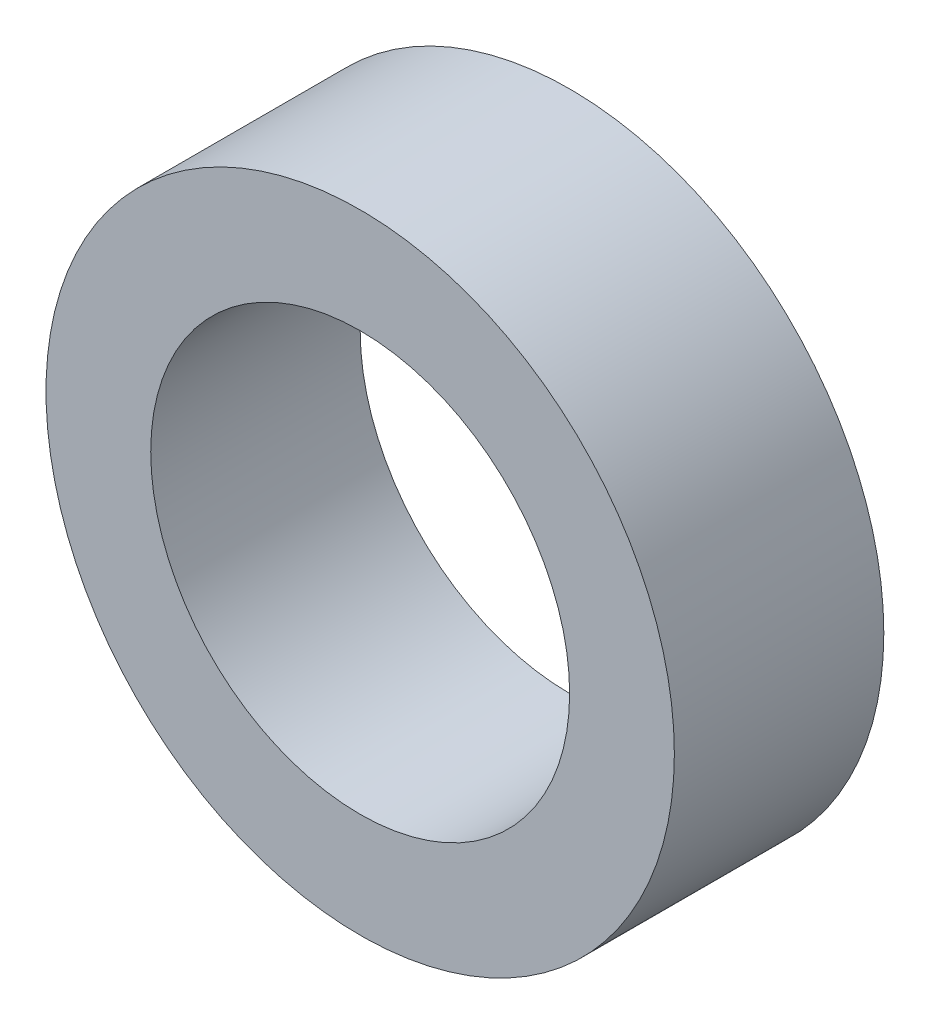
ISO-10303-21;
HEADER;
FILE_DESCRIPTION(('STEP AP214'),'2;1');
FILE_NAME('part.step','',(''),(''),'','','');
FILE_SCHEMA(('AUTOMOTIVE_DESIGN { 1 0 10303 214 1 1 1 1 }'));
ENDSEC;
DATA;
#1=APPLICATION_CONTEXT('core data for automotive mechanical design processes');
#2=APPLICATION_PROTOCOL_DEFINITION('international standard','automotive_design',2000,#1);
#3=PRODUCT_CONTEXT('',#1,'mechanical');
#4=PRODUCT('Part','Part','',(#3));
#5=PRODUCT_RELATED_PRODUCT_CATEGORY('part','',(#4));
#6=PRODUCT_DEFINITION_FORMATION('','',#4);
#7=PRODUCT_DEFINITION_CONTEXT('part definition',#1,'design');
#8=PRODUCT_DEFINITION('design','',#6,#7);
#9=PRODUCT_DEFINITION_SHAPE('','',#8);
#10=(LENGTH_UNIT() NAMED_UNIT(*) SI_UNIT(.MILLI.,.METRE.));
#11=(NAMED_UNIT(*) PLANE_ANGLE_UNIT() SI_UNIT($,.RADIAN.));
#12=(NAMED_UNIT(*) SI_UNIT($,.STERADIAN.) SOLID_ANGLE_UNIT());
#13=UNCERTAINTY_MEASURE_WITH_UNIT(LENGTH_MEASURE(1.E-05),#10,'distance_accuracy_value','');
#14=(GEOMETRIC_REPRESENTATION_CONTEXT(3) GLOBAL_UNCERTAINTY_ASSIGNED_CONTEXT((#13)) GLOBAL_UNIT_ASSIGNED_CONTEXT((#10,
#11,#12)) REPRESENTATION_CONTEXT('',''));
#15=CARTESIAN_POINT('',(0.,0.,0.));
#16=DIRECTION('',(0.,0.,1.));
#17=DIRECTION('',(1.,0.,0.));
#18=AXIS2_PLACEMENT_3D('',#15,#16,#17);
#19=CARTESIAN_POINT('',(0.,0.,3.175));
#20=DIRECTION('',(0.,0.,1.));
#21=DIRECTION('',(1.,0.,0.));
#22=AXIS2_PLACEMENT_3D('',#19,#20,#21);
#23=PLANE('',#22);
#24=CARTESIAN_POINT('',(0.,0.,3.175));
#25=DIRECTION('',(0.,0.,1.));
#26=DIRECTION('',(1.,0.,0.));
#27=AXIS2_PLACEMENT_3D('',#24,#25,#26);
#28=CIRCLE('',#27,4.7625);
#29=CARTESIAN_POINT('',(4.7625,0.,3.175));
#30=VERTEX_POINT('',#29);
#31=EDGE_CURVE('E10',#30,#30,#28,.T.);
#32=ORIENTED_EDGE('',*,*,#31,.T.);
#33=EDGE_LOOP('',(#32));
#34=FACE_BOUND('',#33,.T.);
#35=CARTESIAN_POINT('',(0.,0.,3.175));
#36=DIRECTION('',(0.,0.,1.));
#37=DIRECTION('',(1.,0.,0.));
#38=AXIS2_PLACEMENT_3D('',#35,#36,#37);
#39=CIRCLE('',#38,3.175);
#40=CARTESIAN_POINT('',(3.175,0.,3.175));
#41=VERTEX_POINT('',#40);
#42=EDGE_CURVE('E41',#41,#41,#39,.T.);
#43=ORIENTED_EDGE('',*,*,#42,.F.);
#44=EDGE_LOOP('',(#43));
#45=FACE_BOUND('',#44,.T.);
#46=ADVANCED_FACE('F30',(#34,#45),#23,.T.);
#47=CARTESIAN_POINT('',(0.,0.,0.));
#48=DIRECTION('',(0.,0.,1.));
#49=DIRECTION('',(1.,0.,0.));
#50=AXIS2_PLACEMENT_3D('',#47,#48,#49);
#51=PLANE('',#50);
#52=CARTESIAN_POINT('',(0.,0.,0.));
#53=DIRECTION('',(0.,0.,1.));
#54=DIRECTION('',(1.,0.,0.));
#55=AXIS2_PLACEMENT_3D('',#52,#53,#54);
#56=CIRCLE('',#55,4.7625);
#57=CARTESIAN_POINT('',(4.7625,0.,0.));
#58=VERTEX_POINT('',#57);
#59=EDGE_CURVE('E34',#58,#58,#56,.T.);
#60=ORIENTED_EDGE('',*,*,#59,.F.);
#61=EDGE_LOOP('',(#60));
#62=FACE_BOUND('',#61,.T.);
#63=CARTESIAN_POINT('',(0.,0.,0.));
#64=DIRECTION('',(0.,0.,1.));
#65=DIRECTION('',(1.,0.,0.));
#66=AXIS2_PLACEMENT_3D('',#63,#64,#65);
#67=CIRCLE('',#66,3.175);
#68=CARTESIAN_POINT('',(3.175,0.,0.));
#69=VERTEX_POINT('',#68);
#70=EDGE_CURVE('E43',#69,#69,#67,.T.);
#71=ORIENTED_EDGE('',*,*,#70,.T.);
#72=EDGE_LOOP('',(#71));
#73=FACE_BOUND('',#72,.T.);
#74=ADVANCED_FACE('F53',(#62,#73),#51,.F.);
#75=CARTESIAN_POINT('',(0.,0.,3.175));
#76=DIRECTION('',(0.,0.,-1.));
#77=DIRECTION('',(-1.,0.,0.));
#78=AXIS2_PLACEMENT_3D('',#75,#76,#77);
#79=CYLINDRICAL_SURFACE('',#78,4.7625);
#80=ORIENTED_EDGE('',*,*,#31,.F.);
#81=EDGE_LOOP('',(#80));
#82=FACE_BOUND('',#81,.T.);
#83=ORIENTED_EDGE('',*,*,#59,.T.);
#84=EDGE_LOOP('',(#83));
#85=FACE_BOUND('',#84,.T.);
#86=ADVANCED_FACE('F32',(#82,#85),#79,.T.);
#87=CARTESIAN_POINT('',(0.,0.,3.175));
#88=DIRECTION('',(0.,0.,-1.));
#89=DIRECTION('',(-1.,0.,0.));
#90=AXIS2_PLACEMENT_3D('',#87,#88,#89);
#91=CYLINDRICAL_SURFACE('',#90,3.175);
#92=ORIENTED_EDGE('',*,*,#42,.T.);
#93=EDGE_LOOP('',(#92));
#94=FACE_BOUND('',#93,.T.);
#95=ORIENTED_EDGE('',*,*,#70,.F.);
#96=EDGE_LOOP('',(#95));
#97=FACE_BOUND('',#96,.T.);
#98=ADVANCED_FACE('F49',(#94,#97),#91,.F.);
#99=CLOSED_SHELL('',(#46,#74,#86,#98));
#100=MANIFOLD_SOLID_BREP('B2',#99);
#101=ADVANCED_BREP_SHAPE_REPRESENTATION('',(#18,#100),#14);
#102=SHAPE_DEFINITION_REPRESENTATION(#9,#101);
ENDSEC;
END-ISO-10303-21;
